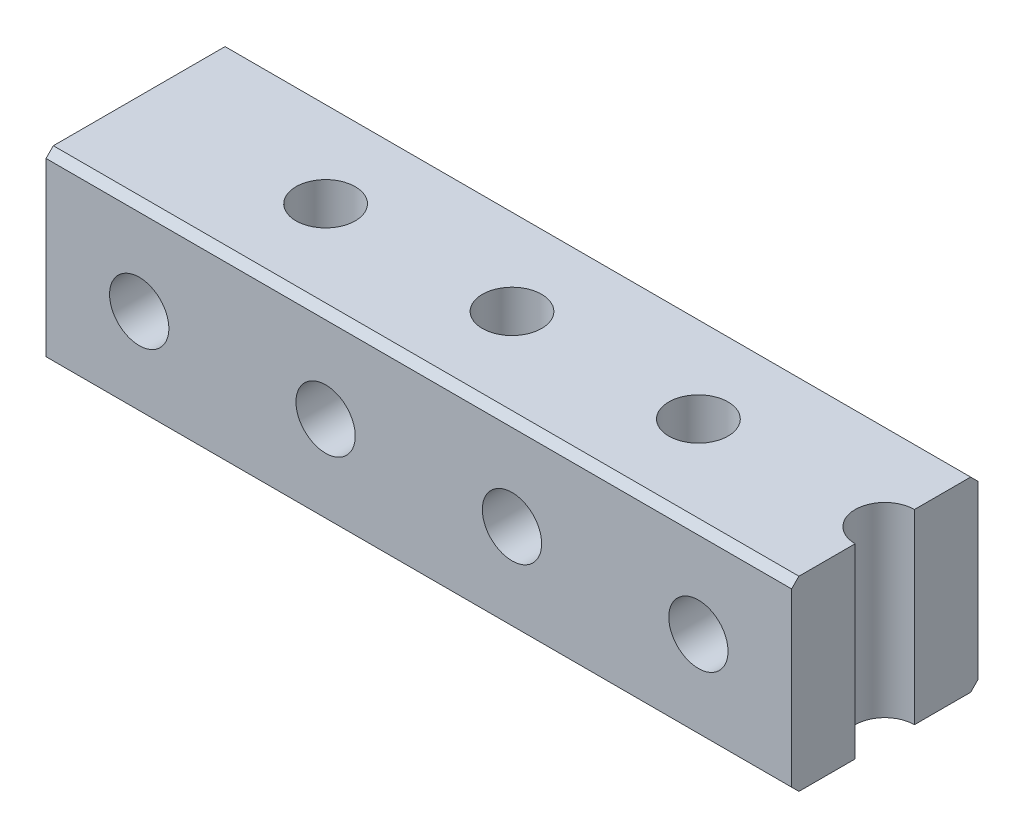
ISO-10303-21;
HEADER;
FILE_DESCRIPTION(('STEP AP214'),'2;1');
FILE_NAME('part.step','',(''),(''),'','','');
FILE_SCHEMA(('AUTOMOTIVE_DESIGN { 1 0 10303 214 1 1 1 1 }'));
ENDSEC;
DATA;
#1=APPLICATION_CONTEXT('core data for automotive mechanical design processes');
#2=APPLICATION_PROTOCOL_DEFINITION('international standard','automotive_design',2000,#1);
#3=PRODUCT_CONTEXT('',#1,'mechanical');
#4=PRODUCT('Part','Part','',(#3));
#5=PRODUCT_RELATED_PRODUCT_CATEGORY('part','',(#4));
#6=PRODUCT_DEFINITION_FORMATION('','',#4);
#7=PRODUCT_DEFINITION_CONTEXT('part definition',#1,'design');
#8=PRODUCT_DEFINITION('design','',#6,#7);
#9=PRODUCT_DEFINITION_SHAPE('','',#8);
#10=(LENGTH_UNIT() NAMED_UNIT(*) SI_UNIT(.MILLI.,.METRE.));
#11=(NAMED_UNIT(*) PLANE_ANGLE_UNIT() SI_UNIT($,.RADIAN.));
#12=(NAMED_UNIT(*) SI_UNIT($,.STERADIAN.) SOLID_ANGLE_UNIT());
#13=UNCERTAINTY_MEASURE_WITH_UNIT(LENGTH_MEASURE(1.E-05),#10,'distance_accuracy_value','');
#14=(GEOMETRIC_REPRESENTATION_CONTEXT(3) GLOBAL_UNCERTAINTY_ASSIGNED_CONTEXT((#13)) GLOBAL_UNIT_ASSIGNED_CONTEXT((#10,
#11,#12)) REPRESENTATION_CONTEXT('',''));
#15=CARTESIAN_POINT('',(0.,0.,0.));
#16=DIRECTION('',(0.,0.,1.));
#17=DIRECTION('',(1.,0.,0.));
#18=AXIS2_PLACEMENT_3D('',#15,#16,#17);
#19=CARTESIAN_POINT('',(25.4,0.,0.));
#20=DIRECTION('',(1.,0.,0.));
#21=DIRECTION('',(0.,1.,0.));
#22=AXIS2_PLACEMENT_3D('',#19,#20,#21);
#23=PLANE('',#22);
#24=DIRECTION('',(0.,1.,0.));
#25=VECTOR('',#24,1.);
#26=CARTESIAN_POINT('',(25.4,-6.35,2.0193));
#27=LINE('',#26,#25);
#28=CARTESIAN_POINT('',(25.4,6.35,2.0193));
#29=VERTEX_POINT('',#28);
#30=CARTESIAN_POINT('',(25.4,-6.35,2.0193));
#31=VERTEX_POINT('',#30);
#32=EDGE_CURVE('E11',#29,#31,#27,.F.);
#33=ORIENTED_EDGE('',*,*,#32,.F.);
#34=DIRECTION('',(0.,0.,-1.));
#35=VECTOR('',#34,1.);
#36=CARTESIAN_POINT('',(25.4,6.35,-2.925));
#37=LINE('',#36,#35);
#38=CARTESIAN_POINT('',(25.4,6.35,5.85));
#39=VERTEX_POINT('',#38);
#40=EDGE_CURVE('E212',#39,#29,#37,.T.);
#41=ORIENTED_EDGE('',*,*,#40,.F.);
#42=DIRECTION('',(0.,0.707106781186547,-0.707106781186548));
#43=VECTOR('',#42,1.);
#44=CARTESIAN_POINT('',(25.4,6.1,6.1));
#45=LINE('',#44,#43);
#46=CARTESIAN_POINT('',(25.4,5.85,6.35));
#47=VERTEX_POINT('',#46);
#48=EDGE_CURVE('E208',#47,#39,#45,.T.);
#49=ORIENTED_EDGE('',*,*,#48,.F.);
#50=DIRECTION('',(0.,1.,0.));
#51=VECTOR('',#50,1.);
#52=CARTESIAN_POINT('',(25.4,2.925,6.35));
#53=LINE('',#52,#51);
#54=CARTESIAN_POINT('',(25.4,-5.85,6.35));
#55=VERTEX_POINT('',#54);
#56=EDGE_CURVE('E204',#55,#47,#53,.T.);
#57=ORIENTED_EDGE('',*,*,#56,.F.);
#58=DIRECTION('',(0.,0.707106781186548,0.707106781186547));
#59=VECTOR('',#58,1.);
#60=CARTESIAN_POINT('',(25.4,-6.1,6.1));
#61=LINE('',#60,#59);
#62=CARTESIAN_POINT('',(25.4,-6.35,5.85));
#63=VERTEX_POINT('',#62);
#64=EDGE_CURVE('E200',#63,#55,#61,.T.);
#65=ORIENTED_EDGE('',*,*,#64,.F.);
#66=DIRECTION('',(0.,0.,1.));
#67=VECTOR('',#66,1.);
#68=CARTESIAN_POINT('',(25.4,-6.35,2.925));
#69=LINE('',#68,#67);
#70=EDGE_CURVE('E199',#31,#63,#69,.T.);
#71=ORIENTED_EDGE('',*,*,#70,.F.);
#72=EDGE_LOOP('',(#33,#41,#49,#57,#65,#71));
#73=FACE_BOUND('',#72,.T.);
#74=ADVANCED_FACE('F17',(#73),#23,.T.);
#75=CARTESIAN_POINT('',(127.,6.1,-6.1));
#76=DIRECTION('',(0.,0.707106781186547,-0.707106781186548));
#77=DIRECTION('',(0.,0.707106781186548,0.707106781186547));
#78=AXIS2_PLACEMENT_3D('',#75,#76,#77);
#79=PLANE('',#78);
#80=DIRECTION('',(0.,-0.707106781186548,-0.707106781186547));
#81=VECTOR('',#80,1.);
#82=CARTESIAN_POINT('',(-25.4,6.1,-6.1));
#83=LINE('',#82,#81);
#84=CARTESIAN_POINT('',(-25.4,6.35,-5.85));
#85=VERTEX_POINT('',#84);
#86=CARTESIAN_POINT('',(-25.4,5.85,-6.35));
#87=VERTEX_POINT('',#86);
#88=EDGE_CURVE('E108',#85,#87,#83,.T.);
#89=ORIENTED_EDGE('',*,*,#88,.F.);
#90=DIRECTION('',(-1.,0.,0.));
#91=VECTOR('',#90,1.);
#92=CARTESIAN_POINT('',(127.,6.35,-5.85));
#93=LINE('',#92,#91);
#94=CARTESIAN_POINT('',(25.4,6.35,-5.85));
#95=VERTEX_POINT('',#94);
#96=EDGE_CURVE('E93',#95,#85,#93,.T.);
#97=ORIENTED_EDGE('',*,*,#96,.F.);
#98=DIRECTION('',(0.,-0.707106781186548,-0.707106781186547));
#99=VECTOR('',#98,1.);
#100=CARTESIAN_POINT('',(25.4,6.1,-6.1));
#101=LINE('',#100,#99);
#102=CARTESIAN_POINT('',(25.4,5.85,-6.35));
#103=VERTEX_POINT('',#102);
#104=EDGE_CURVE('E148',#95,#103,#101,.T.);
#105=ORIENTED_EDGE('',*,*,#104,.T.);
#106=DIRECTION('',(-1.,0.,0.));
#107=VECTOR('',#106,1.);
#108=CARTESIAN_POINT('',(127.,5.85,-6.35));
#109=LINE('',#108,#107);
#110=EDGE_CURVE('E110',#103,#87,#109,.T.);
#111=ORIENTED_EDGE('',*,*,#110,.T.);
#112=EDGE_LOOP('',(#89,#97,#105,#111));
#113=FACE_BOUND('',#112,.T.);
#114=ADVANCED_FACE('F109',(#113),#79,.T.);
#115=CARTESIAN_POINT('',(127.,6.35,-2.925));
#116=DIRECTION('',(0.,1.,0.));
#117=DIRECTION('',(0.,0.,1.));
#118=AXIS2_PLACEMENT_3D('',#115,#116,#117);
#119=PLANE('',#118);
#120=CARTESIAN_POINT('',(-12.7,6.35,0.));
#121=DIRECTION('',(0.,1.,0.));
#122=DIRECTION('',(0.,0.,1.));
#123=AXIS2_PLACEMENT_3D('',#120,#121,#122);
#124=CIRCLE('',#123,2.0193);
#125=CARTESIAN_POINT('',(-12.7,6.35,2.0193));
#126=VERTEX_POINT('',#125);
#127=EDGE_CURVE('E115',#126,#126,#124,.F.);
#128=ORIENTED_EDGE('',*,*,#127,.T.);
#129=EDGE_LOOP('',(#128));
#130=FACE_BOUND('',#129,.T.);
#131=CARTESIAN_POINT('',(0.,6.35,0.));
#132=DIRECTION('',(0.,1.,0.));
#133=DIRECTION('',(0.,0.,1.));
#134=AXIS2_PLACEMENT_3D('',#131,#132,#133);
#135=CIRCLE('',#134,2.0193);
#136=CARTESIAN_POINT('',(0.,6.35,2.0193));
#137=VERTEX_POINT('',#136);
#138=EDGE_CURVE('E259',#137,#137,#135,.F.);
#139=ORIENTED_EDGE('',*,*,#138,.T.);
#140=EDGE_LOOP('',(#139));
#141=FACE_BOUND('',#140,.T.);
#142=CARTESIAN_POINT('',(12.7,6.35,0.));
#143=DIRECTION('',(0.,1.,0.));
#144=DIRECTION('',(0.,0.,1.));
#145=AXIS2_PLACEMENT_3D('',#142,#143,#144);
#146=CIRCLE('',#145,2.0193);
#147=CARTESIAN_POINT('',(12.7,6.35,2.0193));
#148=VERTEX_POINT('',#147);
#149=EDGE_CURVE('E261',#148,#148,#146,.F.);
#150=ORIENTED_EDGE('',*,*,#149,.T.);
#151=EDGE_LOOP('',(#150));
#152=FACE_BOUND('',#151,.T.);
#153=DIRECTION('',(0.,0.,-1.));
#154=VECTOR('',#153,1.);
#155=CARTESIAN_POINT('',(-25.4,6.35,-2.925));
#156=LINE('',#155,#154);
#157=CARTESIAN_POINT('',(-25.4,6.35,5.85));
#158=VERTEX_POINT('',#157);
#159=EDGE_CURVE('E97',#158,#85,#156,.T.);
#160=ORIENTED_EDGE('',*,*,#159,.F.);
#161=DIRECTION('',(-1.,0.,0.));
#162=VECTOR('',#161,1.);
#163=CARTESIAN_POINT('',(127.,6.35,5.85));
#164=LINE('',#163,#162);
#165=EDGE_CURVE('E105',#39,#158,#164,.T.);
#166=ORIENTED_EDGE('',*,*,#165,.F.);
#167=ORIENTED_EDGE('',*,*,#40,.T.);
#168=CARTESIAN_POINT('',(25.4,6.35,0.));
#169=DIRECTION('',(0.,1.,0.));
#170=DIRECTION('',(0.,0.,1.));
#171=AXIS2_PLACEMENT_3D('',#168,#169,#170);
#172=CIRCLE('',#171,2.0193);
#173=CARTESIAN_POINT('',(25.4,6.35,-2.0193));
#174=VERTEX_POINT('',#173);
#175=EDGE_CURVE('E277',#29,#174,#172,.F.);
#176=ORIENTED_EDGE('',*,*,#175,.T.);
#177=EDGE_CURVE('E100',#174,#95,#37,.T.);
#178=ORIENTED_EDGE('',*,*,#177,.T.);
#179=ORIENTED_EDGE('',*,*,#96,.T.);
#180=EDGE_LOOP('',(#160,#166,#167,#176,#178,#179));
#181=FACE_BOUND('',#180,.T.);
#182=ADVANCED_FACE('F95',(#130,#141,#152,#181),#119,.T.);
#183=CARTESIAN_POINT('',(127.,6.1,6.1));
#184=DIRECTION('',(0.,0.707106781186548,0.707106781186547));
#185=DIRECTION('',(0.,-0.707106781186547,0.707106781186548));
#186=AXIS2_PLACEMENT_3D('',#183,#184,#185);
#187=PLANE('',#186);
#188=DIRECTION('',(0.,0.707106781186547,-0.707106781186548));
#189=VECTOR('',#188,1.);
#190=CARTESIAN_POINT('',(-25.4,6.1,6.1));
#191=LINE('',#190,#189);
#192=CARTESIAN_POINT('',(-25.4,5.85,6.35));
#193=VERTEX_POINT('',#192);
#194=EDGE_CURVE('E120',#193,#158,#191,.T.);
#195=ORIENTED_EDGE('',*,*,#194,.F.);
#196=DIRECTION('',(-1.,0.,0.));
#197=VECTOR('',#196,1.);
#198=CARTESIAN_POINT('',(127.,5.85,6.35));
#199=LINE('',#198,#197);
#200=EDGE_CURVE('E164',#47,#193,#199,.T.);
#201=ORIENTED_EDGE('',*,*,#200,.F.);
#202=ORIENTED_EDGE('',*,*,#48,.T.);
#203=ORIENTED_EDGE('',*,*,#165,.T.);
#204=EDGE_LOOP('',(#195,#201,#202,#203));
#205=FACE_BOUND('',#204,.T.);
#206=ADVANCED_FACE('F244',(#205),#187,.T.);
#207=CARTESIAN_POINT('',(127.,2.925,6.35));
#208=DIRECTION('',(0.,0.,1.));
#209=DIRECTION('',(1.,0.,0.));
#210=AXIS2_PLACEMENT_3D('',#207,#208,#209);
#211=PLANE('',#210);
#212=CARTESIAN_POINT('',(-19.05,0.,6.35));
#213=DIRECTION('',(0.,0.,-1.));
#214=DIRECTION('',(-1.,0.,0.));
#215=AXIS2_PLACEMENT_3D('',#212,#213,#214);
#216=CIRCLE('',#215,2.0193);
#217=CARTESIAN_POINT('',(-21.0693,0.,6.35));
#218=VERTEX_POINT('',#217);
#219=EDGE_CURVE('E174',#218,#218,#216,.T.);
#220=ORIENTED_EDGE('',*,*,#219,.T.);
#221=EDGE_LOOP('',(#220));
#222=FACE_BOUND('',#221,.T.);
#223=CARTESIAN_POINT('',(-6.35,0.,6.35));
#224=DIRECTION('',(0.,0.,-1.));
#225=DIRECTION('',(-1.,0.,0.));
#226=AXIS2_PLACEMENT_3D('',#223,#224,#225);
#227=CIRCLE('',#226,2.0193);
#228=CARTESIAN_POINT('',(-8.3693,0.,6.35));
#229=VERTEX_POINT('',#228);
#230=EDGE_CURVE('E256',#229,#229,#227,.T.);
#231=ORIENTED_EDGE('',*,*,#230,.T.);
#232=EDGE_LOOP('',(#231));
#233=FACE_BOUND('',#232,.T.);
#234=CARTESIAN_POINT('',(6.35,0.,6.35));
#235=DIRECTION('',(0.,0.,-1.));
#236=DIRECTION('',(-1.,0.,0.));
#237=AXIS2_PLACEMENT_3D('',#234,#235,#236);
#238=CIRCLE('',#237,2.0193);
#239=CARTESIAN_POINT('',(4.3307,0.,6.35));
#240=VERTEX_POINT('',#239);
#241=EDGE_CURVE('E253',#240,#240,#238,.T.);
#242=ORIENTED_EDGE('',*,*,#241,.T.);
#243=EDGE_LOOP('',(#242));
#244=FACE_BOUND('',#243,.T.);
#245=CARTESIAN_POINT('',(19.05,0.,6.35));
#246=DIRECTION('',(0.,0.,-1.));
#247=DIRECTION('',(-1.,0.,0.));
#248=AXIS2_PLACEMENT_3D('',#245,#246,#247);
#249=CIRCLE('',#248,2.0193);
#250=CARTESIAN_POINT('',(17.0307,0.,6.35));
#251=VERTEX_POINT('',#250);
#252=EDGE_CURVE('E257',#251,#251,#249,.T.);
#253=ORIENTED_EDGE('',*,*,#252,.T.);
#254=EDGE_LOOP('',(#253));
#255=FACE_BOUND('',#254,.T.);
#256=DIRECTION('',(0.,1.,0.));
#257=VECTOR('',#256,1.);
#258=CARTESIAN_POINT('',(-25.4,2.925,6.35));
#259=LINE('',#258,#257);
#260=CARTESIAN_POINT('',(-25.4,-5.85,6.35));
#261=VERTEX_POINT('',#260);
#262=EDGE_CURVE('E127',#261,#193,#259,.T.);
#263=ORIENTED_EDGE('',*,*,#262,.F.);
#264=DIRECTION('',(-1.,0.,0.));
#265=VECTOR('',#264,1.);
#266=CARTESIAN_POINT('',(127.,-5.85,6.35));
#267=LINE('',#266,#265);
#268=EDGE_CURVE('E161',#55,#261,#267,.T.);
#269=ORIENTED_EDGE('',*,*,#268,.F.);
#270=ORIENTED_EDGE('',*,*,#56,.T.);
#271=ORIENTED_EDGE('',*,*,#200,.T.);
#272=EDGE_LOOP('',(#263,#269,#270,#271));
#273=FACE_BOUND('',#272,.T.);
#274=ADVANCED_FACE('F241',(#222,#233,#244,#255,#273),#211,.T.);
#275=CARTESIAN_POINT('',(127.,-6.1,6.1));
#276=DIRECTION('',(0.,-0.707106781186547,0.707106781186548));
#277=DIRECTION('',(0.,-0.707106781186548,-0.707106781186547));
#278=AXIS2_PLACEMENT_3D('',#275,#276,#277);
#279=PLANE('',#278);
#280=DIRECTION('',(0.,0.707106781186548,0.707106781186547));
#281=VECTOR('',#280,1.);
#282=CARTESIAN_POINT('',(-25.4,-6.1,6.1));
#283=LINE('',#282,#281);
#284=CARTESIAN_POINT('',(-25.4,-6.35,5.85));
#285=VERTEX_POINT('',#284);
#286=EDGE_CURVE('E133',#285,#261,#283,.T.);
#287=ORIENTED_EDGE('',*,*,#286,.F.);
#288=DIRECTION('',(-1.,0.,0.));
#289=VECTOR('',#288,1.);
#290=CARTESIAN_POINT('',(127.,-6.35,5.85));
#291=LINE('',#290,#289);
#292=EDGE_CURVE('E158',#63,#285,#291,.T.);
#293=ORIENTED_EDGE('',*,*,#292,.F.);
#294=ORIENTED_EDGE('',*,*,#64,.T.);
#295=ORIENTED_EDGE('',*,*,#268,.T.);
#296=EDGE_LOOP('',(#287,#293,#294,#295));
#297=FACE_BOUND('',#296,.T.);
#298=ADVANCED_FACE('F237',(#297),#279,.T.);
#299=CARTESIAN_POINT('',(127.,-6.35,2.925));
#300=DIRECTION('',(0.,-1.,0.));
#301=DIRECTION('',(0.,0.,-1.));
#302=AXIS2_PLACEMENT_3D('',#299,#300,#301);
#303=PLANE('',#302);
#304=CARTESIAN_POINT('',(-12.7,-6.35,0.));
#305=DIRECTION('',(0.,1.,0.));
#306=DIRECTION('',(0.,0.,1.));
#307=AXIS2_PLACEMENT_3D('',#304,#305,#306);
#308=CIRCLE('',#307,2.0193);
#309=CARTESIAN_POINT('',(-12.7,-6.35,2.0193));
#310=VERTEX_POINT('',#309);
#311=EDGE_CURVE('E273',#310,#310,#308,.T.);
#312=ORIENTED_EDGE('',*,*,#311,.T.);
#313=EDGE_LOOP('',(#312));
#314=FACE_BOUND('',#313,.T.);
#315=CARTESIAN_POINT('',(0.,-6.35,0.));
#316=DIRECTION('',(0.,1.,0.));
#317=DIRECTION('',(0.,0.,1.));
#318=AXIS2_PLACEMENT_3D('',#315,#316,#317);
#319=CIRCLE('',#318,2.0193);
#320=CARTESIAN_POINT('',(0.,-6.35,2.0193));
#321=VERTEX_POINT('',#320);
#322=EDGE_CURVE('E251',#321,#321,#319,.T.);
#323=ORIENTED_EDGE('',*,*,#322,.T.);
#324=EDGE_LOOP('',(#323));
#325=FACE_BOUND('',#324,.T.);
#326=CARTESIAN_POINT('',(12.7,-6.35,0.));
#327=DIRECTION('',(0.,1.,0.));
#328=DIRECTION('',(0.,0.,1.));
#329=AXIS2_PLACEMENT_3D('',#326,#327,#328);
#330=CIRCLE('',#329,2.0193);
#331=CARTESIAN_POINT('',(12.7,-6.35,2.0193));
#332=VERTEX_POINT('',#331);
#333=EDGE_CURVE('E223',#332,#332,#330,.T.);
#334=ORIENTED_EDGE('',*,*,#333,.T.);
#335=EDGE_LOOP('',(#334));
#336=FACE_BOUND('',#335,.T.);
#337=DIRECTION('',(0.,0.,1.));
#338=VECTOR('',#337,1.);
#339=CARTESIAN_POINT('',(-25.4,-6.35,2.925));
#340=LINE('',#339,#338);
#341=CARTESIAN_POINT('',(-25.4,-6.35,-5.85));
#342=VERTEX_POINT('',#341);
#343=EDGE_CURVE('E137',#342,#285,#340,.T.);
#344=ORIENTED_EDGE('',*,*,#343,.F.);
#345=DIRECTION('',(-1.,0.,0.));
#346=VECTOR('',#345,1.);
#347=CARTESIAN_POINT('',(127.,-6.35,-5.85));
#348=LINE('',#347,#346);
#349=CARTESIAN_POINT('',(25.4,-6.35,-5.85));
#350=VERTEX_POINT('',#349);
#351=EDGE_CURVE('E155',#350,#342,#348,.T.);
#352=ORIENTED_EDGE('',*,*,#351,.F.);
#353=CARTESIAN_POINT('',(25.4,-6.35,-2.0193));
#354=VERTEX_POINT('',#353);
#355=EDGE_CURVE('E195',#350,#354,#69,.T.);
#356=ORIENTED_EDGE('',*,*,#355,.T.);
#357=CARTESIAN_POINT('',(25.4,-6.35,0.));
#358=DIRECTION('',(0.,1.,0.));
#359=DIRECTION('',(0.,0.,1.));
#360=AXIS2_PLACEMENT_3D('',#357,#358,#359);
#361=CIRCLE('',#360,2.0193);
#362=EDGE_CURVE('E185',#354,#31,#361,.T.);
#363=ORIENTED_EDGE('',*,*,#362,.T.);
#364=ORIENTED_EDGE('',*,*,#70,.T.);
#365=ORIENTED_EDGE('',*,*,#292,.T.);
#366=EDGE_LOOP('',(#344,#352,#356,#363,#364,#365));
#367=FACE_BOUND('',#366,.T.);
#368=ADVANCED_FACE('F226',(#314,#325,#336,#367),#303,.T.);
#369=CARTESIAN_POINT('',(127.,-6.1,-6.1));
#370=DIRECTION('',(0.,-0.707106781186548,-0.707106781186547));
#371=DIRECTION('',(0.,0.707106781186547,-0.707106781186548));
#372=AXIS2_PLACEMENT_3D('',#369,#370,#371);
#373=PLANE('',#372);
#374=DIRECTION('',(0.,-0.707106781186547,0.707106781186548));
#375=VECTOR('',#374,1.);
#376=CARTESIAN_POINT('',(-25.4,-6.1,-6.1));
#377=LINE('',#376,#375);
#378=CARTESIAN_POINT('',(-25.4,-5.85,-6.35));
#379=VERTEX_POINT('',#378);
#380=EDGE_CURVE('E141',#379,#342,#377,.T.);
#381=ORIENTED_EDGE('',*,*,#380,.F.);
#382=DIRECTION('',(-1.,0.,0.));
#383=VECTOR('',#382,1.);
#384=CARTESIAN_POINT('',(127.,-5.85,-6.35));
#385=LINE('',#384,#383);
#386=CARTESIAN_POINT('',(25.4,-5.85,-6.35));
#387=VERTEX_POINT('',#386);
#388=EDGE_CURVE('E151',#387,#379,#385,.T.);
#389=ORIENTED_EDGE('',*,*,#388,.F.);
#390=DIRECTION('',(0.,-0.707106781186547,0.707106781186548));
#391=VECTOR('',#390,1.);
#392=CARTESIAN_POINT('',(25.4,-6.1,-6.1));
#393=LINE('',#392,#391);
#394=EDGE_CURVE('E191',#387,#350,#393,.T.);
#395=ORIENTED_EDGE('',*,*,#394,.T.);
#396=ORIENTED_EDGE('',*,*,#351,.T.);
#397=EDGE_LOOP('',(#381,#389,#395,#396));
#398=FACE_BOUND('',#397,.T.);
#399=ADVANCED_FACE('F229',(#398),#373,.T.);
#400=CARTESIAN_POINT('',(127.,-2.925,-6.35));
#401=DIRECTION('',(0.,0.,-1.));
#402=DIRECTION('',(-1.,0.,0.));
#403=AXIS2_PLACEMENT_3D('',#400,#401,#402);
#404=PLANE('',#403);
#405=CARTESIAN_POINT('',(-19.05,0.,-6.35));
#406=DIRECTION('',(0.,0.,-1.));
#407=DIRECTION('',(-1.,0.,0.));
#408=AXIS2_PLACEMENT_3D('',#405,#406,#407);
#409=CIRCLE('',#408,2.0193);
#410=CARTESIAN_POINT('',(-21.0693,0.,-6.35));
#411=VERTEX_POINT('',#410);
#412=EDGE_CURVE('E182',#411,#411,#409,.F.);
#413=ORIENTED_EDGE('',*,*,#412,.T.);
#414=EDGE_LOOP('',(#413));
#415=FACE_BOUND('',#414,.T.);
#416=CARTESIAN_POINT('',(-6.35,0.,-6.35));
#417=DIRECTION('',(0.,0.,-1.));
#418=DIRECTION('',(-1.,0.,0.));
#419=AXIS2_PLACEMENT_3D('',#416,#417,#418);
#420=CIRCLE('',#419,2.0193);
#421=CARTESIAN_POINT('',(-8.3693,0.,-6.35));
#422=VERTEX_POINT('',#421);
#423=EDGE_CURVE('E178',#422,#422,#420,.F.);
#424=ORIENTED_EDGE('',*,*,#423,.T.);
#425=EDGE_LOOP('',(#424));
#426=FACE_BOUND('',#425,.T.);
#427=CARTESIAN_POINT('',(6.35,0.,-6.35));
#428=DIRECTION('',(0.,0.,-1.));
#429=DIRECTION('',(-1.,0.,0.));
#430=AXIS2_PLACEMENT_3D('',#427,#428,#429);
#431=CIRCLE('',#430,2.0193);
#432=CARTESIAN_POINT('',(4.3307,0.,-6.35));
#433=VERTEX_POINT('',#432);
#434=EDGE_CURVE('E173',#433,#433,#431,.F.);
#435=ORIENTED_EDGE('',*,*,#434,.T.);
#436=EDGE_LOOP('',(#435));
#437=FACE_BOUND('',#436,.T.);
#438=CARTESIAN_POINT('',(19.05,0.,-6.35));
#439=DIRECTION('',(0.,0.,-1.));
#440=DIRECTION('',(-1.,0.,0.));
#441=AXIS2_PLACEMENT_3D('',#438,#439,#440);
#442=CIRCLE('',#441,2.0193);
#443=CARTESIAN_POINT('',(17.0307,0.,-6.35));
#444=VERTEX_POINT('',#443);
#445=EDGE_CURVE('E169',#444,#444,#442,.F.);
#446=ORIENTED_EDGE('',*,*,#445,.T.);
#447=EDGE_LOOP('',(#446));
#448=FACE_BOUND('',#447,.T.);
#449=DIRECTION('',(0.,-1.,0.));
#450=VECTOR('',#449,1.);
#451=CARTESIAN_POINT('',(-25.4,-2.925,-6.35));
#452=LINE('',#451,#450);
#453=EDGE_CURVE('E145',#87,#379,#452,.T.);
#454=ORIENTED_EDGE('',*,*,#453,.F.);
#455=ORIENTED_EDGE('',*,*,#110,.F.);
#456=DIRECTION('',(0.,-1.,0.));
#457=VECTOR('',#456,1.);
#458=CARTESIAN_POINT('',(25.4,-2.925,-6.35));
#459=LINE('',#458,#457);
#460=EDGE_CURVE('E152',#103,#387,#459,.T.);
#461=ORIENTED_EDGE('',*,*,#460,.T.);
#462=ORIENTED_EDGE('',*,*,#388,.T.);
#463=EDGE_LOOP('',(#454,#455,#461,#462));
#464=FACE_BOUND('',#463,.T.);
#465=ADVANCED_FACE('F232',(#415,#426,#437,#448,#464),#404,.T.);
#466=ORIENTED_EDGE('',*,*,#177,.F.);
#467=DIRECTION('',(0.,1.,0.));
#468=VECTOR('',#467,1.);
#469=CARTESIAN_POINT('',(25.4,-6.35,-2.0193));
#470=LINE('',#469,#468);
#471=EDGE_CURVE('E26',#174,#354,#470,.F.);
#472=ORIENTED_EDGE('',*,*,#471,.T.);
#473=ORIENTED_EDGE('',*,*,#355,.F.);
#474=ORIENTED_EDGE('',*,*,#394,.F.);
#475=ORIENTED_EDGE('',*,*,#460,.F.);
#476=ORIENTED_EDGE('',*,*,#104,.F.);
#477=EDGE_LOOP('',(#466,#472,#473,#474,#475,#476));
#478=FACE_BOUND('',#477,.T.);
#479=ADVANCED_FACE('F19',(#478),#23,.T.);
#480=CARTESIAN_POINT('',(-25.4,0.,0.));
#481=DIRECTION('',(1.,0.,0.));
#482=DIRECTION('',(0.,1.,0.));
#483=AXIS2_PLACEMENT_3D('',#480,#481,#482);
#484=PLANE('',#483);
#485=ORIENTED_EDGE('',*,*,#88,.T.);
#486=ORIENTED_EDGE('',*,*,#453,.T.);
#487=ORIENTED_EDGE('',*,*,#380,.T.);
#488=ORIENTED_EDGE('',*,*,#343,.T.);
#489=ORIENTED_EDGE('',*,*,#286,.T.);
#490=ORIENTED_EDGE('',*,*,#262,.T.);
#491=ORIENTED_EDGE('',*,*,#194,.T.);
#492=ORIENTED_EDGE('',*,*,#159,.T.);
#493=EDGE_LOOP('',(#485,#486,#487,#488,#489,#490,#491,#492));
#494=FACE_BOUND('',#493,.T.);
#495=ADVANCED_FACE('F117',(#494),#484,.F.);
#496=CARTESIAN_POINT('',(25.4,-6.35,0.));
#497=DIRECTION('',(0.,1.,0.));
#498=DIRECTION('',(0.,0.,1.));
#499=AXIS2_PLACEMENT_3D('',#496,#497,#498);
#500=CYLINDRICAL_SURFACE('',#499,2.0193);
#501=ORIENTED_EDGE('',*,*,#175,.F.);
#502=ORIENTED_EDGE('',*,*,#32,.T.);
#503=ORIENTED_EDGE('',*,*,#362,.F.);
#504=ORIENTED_EDGE('',*,*,#471,.F.);
#505=EDGE_LOOP('',(#501,#502,#503,#504));
#506=FACE_BOUND('',#505,.T.);
#507=ADVANCED_FACE('F220',(#506),#500,.F.);
#508=CARTESIAN_POINT('',(12.7,-6.35,0.));
#509=DIRECTION('',(0.,1.,0.));
#510=DIRECTION('',(0.,0.,1.));
#511=AXIS2_PLACEMENT_3D('',#508,#509,#510);
#512=CYLINDRICAL_SURFACE('',#511,2.0193);
#513=ORIENTED_EDGE('',*,*,#149,.F.);
#514=EDGE_LOOP('',(#513));
#515=FACE_BOUND('',#514,.T.);
#516=ORIENTED_EDGE('',*,*,#333,.F.);
#517=EDGE_LOOP('',(#516));
#518=FACE_BOUND('',#517,.T.);
#519=ADVANCED_FACE('F291',(#515,#518),#512,.F.);
#520=CARTESIAN_POINT('',(0.,-6.35,0.));
#521=DIRECTION('',(0.,1.,0.));
#522=DIRECTION('',(0.,0.,1.));
#523=AXIS2_PLACEMENT_3D('',#520,#521,#522);
#524=CYLINDRICAL_SURFACE('',#523,2.0193);
#525=ORIENTED_EDGE('',*,*,#138,.F.);
#526=EDGE_LOOP('',(#525));
#527=FACE_BOUND('',#526,.T.);
#528=ORIENTED_EDGE('',*,*,#322,.F.);
#529=EDGE_LOOP('',(#528));
#530=FACE_BOUND('',#529,.T.);
#531=ADVANCED_FACE('F294',(#527,#530),#524,.F.);
#532=CARTESIAN_POINT('',(-12.7,-6.35,0.));
#533=DIRECTION('',(0.,1.,0.));
#534=DIRECTION('',(0.,0.,1.));
#535=AXIS2_PLACEMENT_3D('',#532,#533,#534);
#536=CYLINDRICAL_SURFACE('',#535,2.0193);
#537=ORIENTED_EDGE('',*,*,#127,.F.);
#538=EDGE_LOOP('',(#537));
#539=FACE_BOUND('',#538,.T.);
#540=ORIENTED_EDGE('',*,*,#311,.F.);
#541=EDGE_LOOP('',(#540));
#542=FACE_BOUND('',#541,.T.);
#543=ADVANCED_FACE('F324',(#539,#542),#536,.F.);
#544=CARTESIAN_POINT('',(19.05,0.,6.35));
#545=DIRECTION('',(0.,0.,-1.));
#546=DIRECTION('',(-1.,0.,0.));
#547=AXIS2_PLACEMENT_3D('',#544,#545,#546);
#548=CYLINDRICAL_SURFACE('',#547,2.0193);
#549=ORIENTED_EDGE('',*,*,#445,.F.);
#550=EDGE_LOOP('',(#549));
#551=FACE_BOUND('',#550,.T.);
#552=ORIENTED_EDGE('',*,*,#252,.F.);
#553=EDGE_LOOP('',(#552));
#554=FACE_BOUND('',#553,.T.);
#555=ADVANCED_FACE('F328',(#551,#554),#548,.F.);
#556=CARTESIAN_POINT('',(6.35,0.,6.35));
#557=DIRECTION('',(0.,0.,-1.));
#558=DIRECTION('',(-1.,0.,0.));
#559=AXIS2_PLACEMENT_3D('',#556,#557,#558);
#560=CYLINDRICAL_SURFACE('',#559,2.0193);
#561=ORIENTED_EDGE('',*,*,#434,.F.);
#562=EDGE_LOOP('',(#561));
#563=FACE_BOUND('',#562,.T.);
#564=ORIENTED_EDGE('',*,*,#241,.F.);
#565=EDGE_LOOP('',(#564));
#566=FACE_BOUND('',#565,.T.);
#567=ADVANCED_FACE('F332',(#563,#566),#560,.F.);
#568=CARTESIAN_POINT('',(-6.35,0.,6.35));
#569=DIRECTION('',(0.,0.,-1.));
#570=DIRECTION('',(-1.,0.,0.));
#571=AXIS2_PLACEMENT_3D('',#568,#569,#570);
#572=CYLINDRICAL_SURFACE('',#571,2.0193);
#573=ORIENTED_EDGE('',*,*,#423,.F.);
#574=EDGE_LOOP('',(#573));
#575=FACE_BOUND('',#574,.T.);
#576=ORIENTED_EDGE('',*,*,#230,.F.);
#577=EDGE_LOOP('',(#576));
#578=FACE_BOUND('',#577,.T.);
#579=ADVANCED_FACE('F336',(#575,#578),#572,.F.);
#580=CARTESIAN_POINT('',(-19.05,0.,6.35));
#581=DIRECTION('',(0.,0.,-1.));
#582=DIRECTION('',(-1.,0.,0.));
#583=AXIS2_PLACEMENT_3D('',#580,#581,#582);
#584=CYLINDRICAL_SURFACE('',#583,2.0193);
#585=ORIENTED_EDGE('',*,*,#412,.F.);
#586=EDGE_LOOP('',(#585));
#587=FACE_BOUND('',#586,.T.);
#588=ORIENTED_EDGE('',*,*,#219,.F.);
#589=EDGE_LOOP('',(#588));
#590=FACE_BOUND('',#589,.T.);
#591=ADVANCED_FACE('F340',(#587,#590),#584,.F.);
#592=CLOSED_SHELL('',(#74,#114,#182,#206,#274,#298,#368,#399,#465,#479,#495,#507,#519,#531,#543,
#555,#567,#579,#591));
#593=MANIFOLD_SOLID_BREP('B1',#592);
#594=ADVANCED_BREP_SHAPE_REPRESENTATION('',(#18,#593),#14);
#595=SHAPE_DEFINITION_REPRESENTATION(#9,#594);
ENDSEC;
END-ISO-10303-21;
